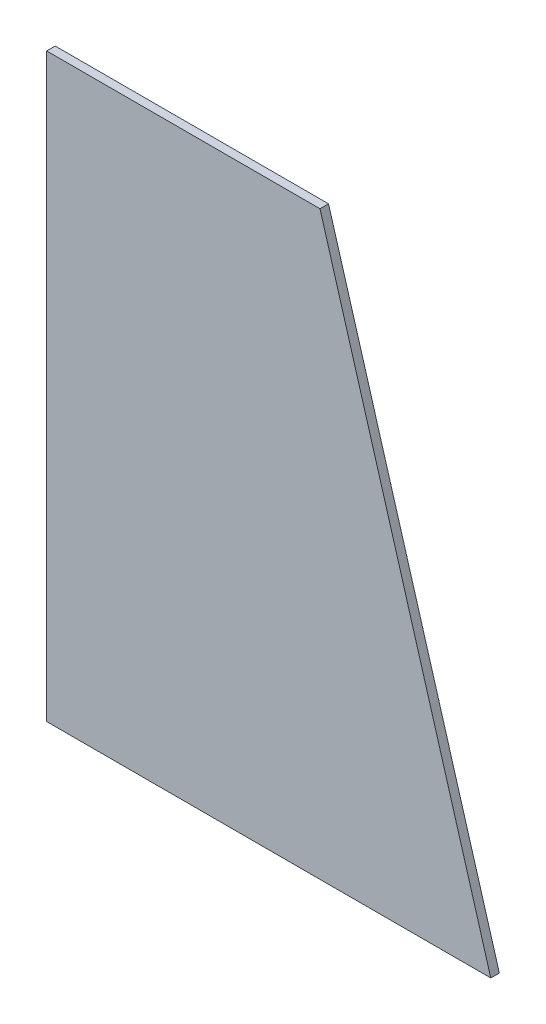
ISO-10303-21;
HEADER;
FILE_DESCRIPTION(('STEP AP214'),'2;1');
FILE_NAME('part.step','',(''),(''),'','','');
FILE_SCHEMA(('AUTOMOTIVE_DESIGN { 1 0 10303 214 1 1 1 1 }'));
ENDSEC;
DATA;
#1=APPLICATION_CONTEXT('core data for automotive mechanical design processes');
#2=APPLICATION_PROTOCOL_DEFINITION('international standard','automotive_design',2000,#1);
#3=PRODUCT_CONTEXT('',#1,'mechanical');
#4=PRODUCT('Part','Part','',(#3));
#5=PRODUCT_RELATED_PRODUCT_CATEGORY('part','',(#4));
#6=PRODUCT_DEFINITION_FORMATION('','',#4);
#7=PRODUCT_DEFINITION_CONTEXT('part definition',#1,'design');
#8=PRODUCT_DEFINITION('design','',#6,#7);
#9=PRODUCT_DEFINITION_SHAPE('','',#8);
#10=(LENGTH_UNIT() NAMED_UNIT(*) SI_UNIT(.MILLI.,.METRE.));
#11=(NAMED_UNIT(*) PLANE_ANGLE_UNIT() SI_UNIT($,.RADIAN.));
#12=(NAMED_UNIT(*) SI_UNIT($,.STERADIAN.) SOLID_ANGLE_UNIT());
#13=UNCERTAINTY_MEASURE_WITH_UNIT(LENGTH_MEASURE(1.E-05),#10,'distance_accuracy_value','');
#14=(GEOMETRIC_REPRESENTATION_CONTEXT(3) GLOBAL_UNCERTAINTY_ASSIGNED_CONTEXT((#13)) GLOBAL_UNIT_ASSIGNED_CONTEXT((#10,
#11,#12)) REPRESENTATION_CONTEXT('',''));
#15=CARTESIAN_POINT('',(0.,0.,0.));
#16=DIRECTION('',(0.,0.,1.));
#17=DIRECTION('',(1.,0.,0.));
#18=AXIS2_PLACEMENT_3D('',#15,#16,#17);
#19=CARTESIAN_POINT('',(0.,107.95,-3.175));
#20=DIRECTION('',(-1.,0.,0.));
#21=DIRECTION('',(0.,-1.,0.));
#22=AXIS2_PLACEMENT_3D('',#19,#20,#21);
#23=PLANE('',#22);
#24=DIRECTION('',(0.,-1.,0.));
#25=VECTOR('',#24,1.);
#26=CARTESIAN_POINT('',(0.,107.95,0.));
#27=LINE('',#26,#25);
#28=CARTESIAN_POINT('',(0.,107.95,0.));
#29=VERTEX_POINT('',#28);
#30=CARTESIAN_POINT('',(0.,-107.95,0.));
#31=VERTEX_POINT('',#30);
#32=EDGE_CURVE('E117',#29,#31,#27,.T.);
#33=ORIENTED_EDGE('',*,*,#32,.F.);
#34=DIRECTION('',(0.,0.,1.));
#35=VECTOR('',#34,1.);
#36=CARTESIAN_POINT('',(0.,107.95,-3.175));
#37=LINE('',#36,#35);
#38=CARTESIAN_POINT('',(0.,107.95,-3.175));
#39=VERTEX_POINT('',#38);
#40=EDGE_CURVE('E11',#39,#29,#37,.T.);
#41=ORIENTED_EDGE('',*,*,#40,.F.);
#42=DIRECTION('',(0.,-1.,0.));
#43=VECTOR('',#42,1.);
#44=CARTESIAN_POINT('',(0.,107.95,-3.175));
#45=LINE('',#44,#43);
#46=CARTESIAN_POINT('',(0.,-107.95,-3.175));
#47=VERTEX_POINT('',#46);
#48=EDGE_CURVE('E109',#39,#47,#45,.T.);
#49=ORIENTED_EDGE('',*,*,#48,.T.);
#50=DIRECTION('',(0.,0.,1.));
#51=VECTOR('',#50,1.);
#52=CARTESIAN_POINT('',(0.,-107.95,-3.175));
#53=LINE('',#52,#51);
#54=EDGE_CURVE('E50',#47,#31,#53,.T.);
#55=ORIENTED_EDGE('',*,*,#54,.T.);
#56=EDGE_LOOP('',(#33,#41,#49,#55));
#57=FACE_BOUND('',#56,.T.);
#58=ADVANCED_FACE('F47',(#57),#23,.T.);
#59=CARTESIAN_POINT('',(0.,107.95,-3.175));
#60=DIRECTION('',(0.,1.,0.));
#61=DIRECTION('',(0.,0.,1.));
#62=AXIS2_PLACEMENT_3D('',#59,#60,#61);
#63=PLANE('',#62);
#64=DIRECTION('',(-1.,0.,0.));
#65=VECTOR('',#64,1.);
#66=CARTESIAN_POINT('',(0.,107.95,0.));
#67=LINE('',#66,#65);
#68=CARTESIAN_POINT('',(101.6,107.95,0.));
#69=VERTEX_POINT('',#68);
#70=EDGE_CURVE('E112',#69,#29,#67,.T.);
#71=ORIENTED_EDGE('',*,*,#70,.F.);
#72=DIRECTION('',(0.,0.,1.));
#73=VECTOR('',#72,1.);
#74=CARTESIAN_POINT('',(101.6,107.95,-3.175));
#75=LINE('',#74,#73);
#76=CARTESIAN_POINT('',(101.6,107.95,-3.175));
#77=VERTEX_POINT('',#76);
#78=EDGE_CURVE('E57',#77,#69,#75,.T.);
#79=ORIENTED_EDGE('',*,*,#78,.F.);
#80=DIRECTION('',(-1.,0.,0.));
#81=VECTOR('',#80,1.);
#82=CARTESIAN_POINT('',(0.,107.95,-3.175));
#83=LINE('',#82,#81);
#84=EDGE_CURVE('E104',#77,#39,#83,.T.);
#85=ORIENTED_EDGE('',*,*,#84,.T.);
#86=ORIENTED_EDGE('',*,*,#40,.T.);
#87=EDGE_LOOP('',(#71,#79,#85,#86));
#88=FACE_BOUND('',#87,.T.);
#89=ADVANCED_FACE('F133',(#88),#63,.T.);
#90=CARTESIAN_POINT('',(101.6,107.95,-3.175));
#91=DIRECTION('',(0.95936550157127,0.282166323991551,0.));
#92=DIRECTION('',(-0.282166323991551,0.95936550157127,0.));
#93=AXIS2_PLACEMENT_3D('',#90,#91,#92);
#94=PLANE('',#93);
#95=DIRECTION('',(-0.282166323991551,0.95936550157127,0.));
#96=VECTOR('',#95,1.);
#97=CARTESIAN_POINT('',(101.6,107.95,0.));
#98=LINE('',#97,#96);
#99=CARTESIAN_POINT('',(165.1,-107.95,0.));
#100=VERTEX_POINT('',#99);
#101=EDGE_CURVE('E98',#100,#69,#98,.T.);
#102=ORIENTED_EDGE('',*,*,#101,.F.);
#103=DIRECTION('',(0.,0.,1.));
#104=VECTOR('',#103,1.);
#105=CARTESIAN_POINT('',(165.1,-107.95,-3.175));
#106=LINE('',#105,#104);
#107=CARTESIAN_POINT('',(165.1,-107.95,-3.175));
#108=VERTEX_POINT('',#107);
#109=EDGE_CURVE('E93',#108,#100,#106,.T.);
#110=ORIENTED_EDGE('',*,*,#109,.F.);
#111=DIRECTION('',(-0.282166323991551,0.95936550157127,0.));
#112=VECTOR('',#111,1.);
#113=CARTESIAN_POINT('',(101.6,107.95,-3.175));
#114=LINE('',#113,#112);
#115=EDGE_CURVE('E96',#108,#77,#114,.T.);
#116=ORIENTED_EDGE('',*,*,#115,.T.);
#117=ORIENTED_EDGE('',*,*,#78,.T.);
#118=EDGE_LOOP('',(#102,#110,#116,#117));
#119=FACE_BOUND('',#118,.T.);
#120=ADVANCED_FACE('F95',(#119),#94,.T.);
#121=CARTESIAN_POINT('',(0.,-107.95,-3.175));
#122=DIRECTION('',(0.,-1.,0.));
#123=DIRECTION('',(1.,0.,0.));
#124=AXIS2_PLACEMENT_3D('',#121,#122,#123);
#125=PLANE('',#124);
#126=DIRECTION('',(1.,0.,0.));
#127=VECTOR('',#126,1.);
#128=CARTESIAN_POINT('',(0.,-107.95,0.));
#129=LINE('',#128,#127);
#130=EDGE_CURVE('E121',#31,#100,#129,.T.);
#131=ORIENTED_EDGE('',*,*,#130,.F.);
#132=ORIENTED_EDGE('',*,*,#54,.F.);
#133=DIRECTION('',(1.,0.,0.));
#134=VECTOR('',#133,1.);
#135=CARTESIAN_POINT('',(0.,-107.95,-3.175));
#136=LINE('',#135,#134);
#137=EDGE_CURVE('E103',#47,#108,#136,.T.);
#138=ORIENTED_EDGE('',*,*,#137,.T.);
#139=ORIENTED_EDGE('',*,*,#109,.T.);
#140=EDGE_LOOP('',(#131,#132,#138,#139));
#141=FACE_BOUND('',#140,.T.);
#142=ADVANCED_FACE('F107',(#141),#125,.T.);
#143=CARTESIAN_POINT('',(0.,0.,-3.175));
#144=DIRECTION('',(0.,0.,1.));
#145=DIRECTION('',(1.,0.,0.));
#146=AXIS2_PLACEMENT_3D('',#143,#144,#145);
#147=PLANE('',#146);
#148=ORIENTED_EDGE('',*,*,#48,.F.);
#149=ORIENTED_EDGE('',*,*,#84,.F.);
#150=ORIENTED_EDGE('',*,*,#115,.F.);
#151=ORIENTED_EDGE('',*,*,#137,.F.);
#152=EDGE_LOOP('',(#148,#149,#150,#151));
#153=FACE_BOUND('',#152,.T.);
#154=ADVANCED_FACE('F102',(#153),#147,.F.);
#155=CARTESIAN_POINT('',(0.,0.,0.));
#156=DIRECTION('',(0.,0.,1.));
#157=DIRECTION('',(1.,0.,0.));
#158=AXIS2_PLACEMENT_3D('',#155,#156,#157);
#159=PLANE('',#158);
#160=ORIENTED_EDGE('',*,*,#32,.T.);
#161=ORIENTED_EDGE('',*,*,#130,.T.);
#162=ORIENTED_EDGE('',*,*,#101,.T.);
#163=ORIENTED_EDGE('',*,*,#70,.T.);
#164=EDGE_LOOP('',(#160,#161,#162,#163));
#165=FACE_BOUND('',#164,.T.);
#166=ADVANCED_FACE('F132',(#165),#159,.T.);
#167=CLOSED_SHELL('',(#58,#89,#120,#142,#154,#166));
#168=MANIFOLD_SOLID_BREP('B2',#167);
#169=ADVANCED_BREP_SHAPE_REPRESENTATION('',(#18,#168),#14);
#170=SHAPE_DEFINITION_REPRESENTATION(#9,#169);
ENDSEC;
END-ISO-10303-21;
